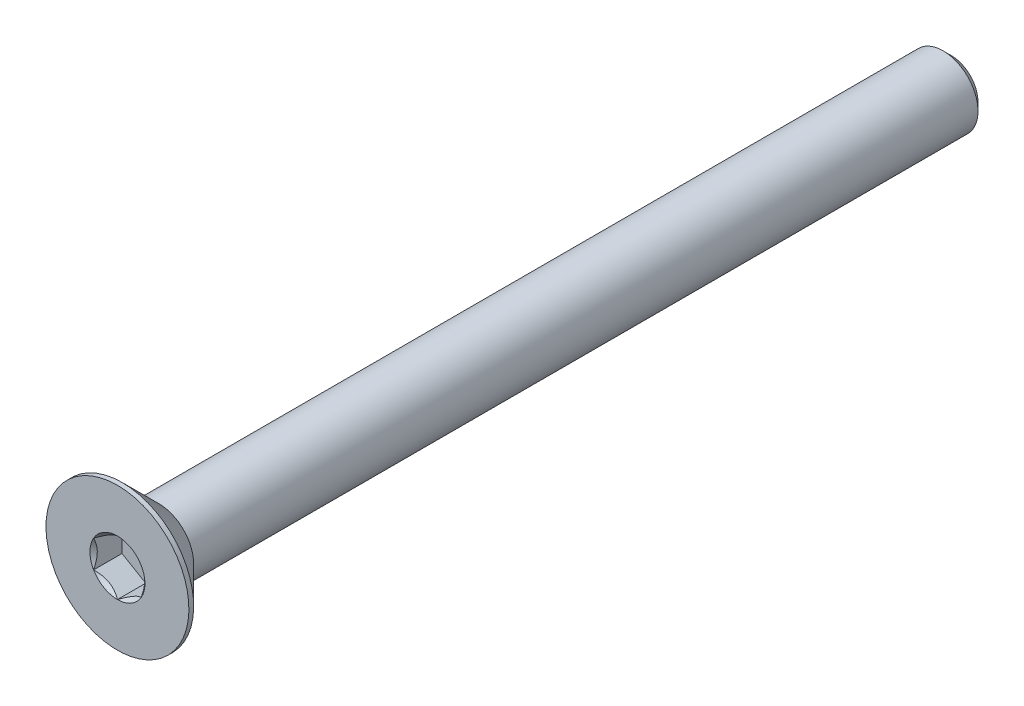
ISO-10303-21;
HEADER;
FILE_DESCRIPTION(('STEP AP214'),'2;1');
FILE_NAME('part.step','',(''),(''),'','','');
FILE_SCHEMA(('AUTOMOTIVE_DESIGN { 1 0 10303 214 1 1 1 1 }'));
ENDSEC;
DATA;
#1=APPLICATION_CONTEXT('core data for automotive mechanical design processes');
#2=APPLICATION_PROTOCOL_DEFINITION('international standard','automotive_design',2000,#1);
#3=PRODUCT_CONTEXT('',#1,'mechanical');
#4=PRODUCT('Part','Part','',(#3));
#5=PRODUCT_RELATED_PRODUCT_CATEGORY('part','',(#4));
#6=PRODUCT_DEFINITION_FORMATION('','',#4);
#7=PRODUCT_DEFINITION_CONTEXT('part definition',#1,'design');
#8=PRODUCT_DEFINITION('design','',#6,#7);
#9=PRODUCT_DEFINITION_SHAPE('','',#8);
#10=(LENGTH_UNIT() NAMED_UNIT(*) SI_UNIT(.MILLI.,.METRE.));
#11=(NAMED_UNIT(*) PLANE_ANGLE_UNIT() SI_UNIT($,.RADIAN.));
#12=(NAMED_UNIT(*) SI_UNIT($,.STERADIAN.) SOLID_ANGLE_UNIT());
#13=UNCERTAINTY_MEASURE_WITH_UNIT(LENGTH_MEASURE(1.E-05),#10,'distance_accuracy_value','');
#14=(GEOMETRIC_REPRESENTATION_CONTEXT(3) GLOBAL_UNCERTAINTY_ASSIGNED_CONTEXT((#13)) GLOBAL_UNIT_ASSIGNED_CONTEXT((#10,
#11,#12)) REPRESENTATION_CONTEXT('',''));
#15=CARTESIAN_POINT('',(0.,0.,0.));
#16=DIRECTION('',(0.,0.,1.));
#17=DIRECTION('',(1.,0.,0.));
#18=AXIS2_PLACEMENT_3D('',#15,#16,#17);
#19=CARTESIAN_POINT('',(0.,-1.15470053837925,-1.19));
#20=DIRECTION('',(0.5,-0.866025403784439,0.));
#21=DIRECTION('',(0.,0.,-1.));
#22=AXIS2_PLACEMENT_3D('',#19,#20,#21);
#23=PLANE('',#22);
#24=DIRECTION('',(0.,0.,1.));
#25=VECTOR('',#24,1.);
#26=CARTESIAN_POINT('',(0.,-1.15470053837925,-1.19));
#27=LINE('',#26,#25);
#28=CARTESIAN_POINT('',(0.,-1.15470053837925,-1.19));
#29=VERTEX_POINT('',#28);
#30=CARTESIAN_POINT('',(0.,-1.15470053837925,0.));
#31=VERTEX_POINT('',#30);
#32=EDGE_CURVE('E11',#29,#31,#27,.T.);
#33=ORIENTED_EDGE('',*,*,#32,.T.);
#34=CARTESIAN_POINT('',(0.,-1.15470053837922,0.));
#35=CARTESIAN_POINT('',(0.5,-0.866025403784439,-0.288675134594791));
#36=CARTESIAN_POINT('',(0.999999999999948,-0.577350269189655,0.));
#37=(BOUNDED_CURVE() B_SPLINE_CURVE(2,(#34,#35,#36),.UNSPECIFIED.,.F.,
.F.) B_SPLINE_CURVE_WITH_KNOTS((3,3),(-0.321867155116299,-0.124274873543865),
.UNSPECIFIED.) CURVE() GEOMETRIC_REPRESENTATION_ITEM() RATIONAL_B_SPLINE_CURVE((1.46410161513778,
1.69059892324148,1.46410161513778)) REPRESENTATION_ITEM(''));
#38=CARTESIAN_POINT('',(1.,-0.577350269189626,0.));
#39=VERTEX_POINT('',#38);
#40=EDGE_CURVE('E201',#31,#39,#37,.T.);
#41=ORIENTED_EDGE('',*,*,#40,.T.);
#42=DIRECTION('',(0.,0.,1.));
#43=VECTOR('',#42,1.);
#44=CARTESIAN_POINT('',(1.,-0.577350269189626,-1.19));
#45=LINE('',#44,#43);
#46=CARTESIAN_POINT('',(1.,-0.577350269189626,-1.19));
#47=VERTEX_POINT('',#46);
#48=EDGE_CURVE('E181',#47,#39,#45,.T.);
#49=ORIENTED_EDGE('',*,*,#48,.F.);
#50=DIRECTION('',(0.866025403784439,0.5,0.));
#51=VECTOR('',#50,1.);
#52=CARTESIAN_POINT('',(0.,-1.15470053837925,-1.19));
#53=LINE('',#52,#51);
#54=EDGE_CURVE('E193',#29,#47,#53,.T.);
#55=ORIENTED_EDGE('',*,*,#54,.F.);
#56=EDGE_LOOP('',(#33,#41,#49,#55));
#57=FACE_BOUND('',#56,.T.);
#58=ADVANCED_FACE('F17',(#57),#23,.F.);
#59=CARTESIAN_POINT('',(-1.,-0.577350269189626,-1.19));
#60=DIRECTION('',(-0.5,-0.866025403784439,0.));
#61=DIRECTION('',(-0.866025403784439,0.5,0.));
#62=AXIS2_PLACEMENT_3D('',#59,#60,#61);
#63=PLANE('',#62);
#64=DIRECTION('',(0.,0.,1.));
#65=VECTOR('',#64,1.);
#66=CARTESIAN_POINT('',(-1.,-0.577350269189626,-1.19));
#67=LINE('',#66,#65);
#68=CARTESIAN_POINT('',(-1.,-0.577350269189626,-1.19));
#69=VERTEX_POINT('',#68);
#70=CARTESIAN_POINT('',(-1.,-0.577350269189626,0.));
#71=VERTEX_POINT('',#70);
#72=EDGE_CURVE('E21',#69,#71,#67,.T.);
#73=ORIENTED_EDGE('',*,*,#72,.T.);
#74=CARTESIAN_POINT('',(-0.999999999999948,-0.577350269189655,0.));
#75=CARTESIAN_POINT('',(-0.499999999999999,-0.866025403784439,-0.28867513459479));
#76=CARTESIAN_POINT('',(0.,-1.15470053837922,0.));
#77=(BOUNDED_CURVE() B_SPLINE_CURVE(2,(#74,#75,#76),.UNSPECIFIED.,.F.,
.F.) B_SPLINE_CURVE_WITH_KNOTS((3,3),(-0.321867155116299,-0.124274873543865),
.UNSPECIFIED.) CURVE() GEOMETRIC_REPRESENTATION_ITEM() RATIONAL_B_SPLINE_CURVE((1.46410161513778,
1.69059892324148,1.46410161513778)) REPRESENTATION_ITEM(''));
#78=EDGE_CURVE('E167',#71,#31,#77,.T.);
#79=ORIENTED_EDGE('',*,*,#78,.T.);
#80=ORIENTED_EDGE('',*,*,#32,.F.);
#81=DIRECTION('',(0.866025403784439,-0.5,0.));
#82=VECTOR('',#81,1.);
#83=CARTESIAN_POINT('',(-1.,-0.577350269189626,-1.19));
#84=LINE('',#83,#82);
#85=EDGE_CURVE('E185',#69,#29,#84,.T.);
#86=ORIENTED_EDGE('',*,*,#85,.F.);
#87=EDGE_LOOP('',(#73,#79,#80,#86));
#88=FACE_BOUND('',#87,.T.);
#89=ADVANCED_FACE('F403',(#88),#63,.F.);
#90=CARTESIAN_POINT('',(-1.,0.577350269189626,-1.19));
#91=DIRECTION('',(-1.,0.,0.));
#92=DIRECTION('',(0.,0.,1.));
#93=AXIS2_PLACEMENT_3D('',#90,#91,#92);
#94=PLANE('',#93);
#95=DIRECTION('',(0.,0.,1.));
#96=VECTOR('',#95,1.);
#97=CARTESIAN_POINT('',(-1.,0.577350269189626,-1.19));
#98=LINE('',#97,#96);
#99=CARTESIAN_POINT('',(-1.,0.577350269189626,-1.19));
#100=VERTEX_POINT('',#99);
#101=CARTESIAN_POINT('',(-1.,0.577350269189626,0.));
#102=VERTEX_POINT('',#101);
#103=EDGE_CURVE('E65',#100,#102,#98,.T.);
#104=ORIENTED_EDGE('',*,*,#103,.T.);
#105=CARTESIAN_POINT('',(-1.,0.577350269189569,0.));
#106=CARTESIAN_POINT('',(-1.,0.,-0.28867513459479));
#107=CARTESIAN_POINT('',(-1.,-0.577350269189568,0.));
#108=(BOUNDED_CURVE() B_SPLINE_CURVE(2,(#105,#106,#107),.UNSPECIFIED.,.F.,
.F.) B_SPLINE_CURVE_WITH_KNOTS((3,3),(-0.3218671551163,-0.124274873543865),
.UNSPECIFIED.) CURVE() GEOMETRIC_REPRESENTATION_ITEM() RATIONAL_B_SPLINE_CURVE((1.46410161513777,
1.69059892324148,1.46410161513777)) REPRESENTATION_ITEM(''));
#109=EDGE_CURVE('E162',#102,#71,#108,.T.);
#110=ORIENTED_EDGE('',*,*,#109,.T.);
#111=ORIENTED_EDGE('',*,*,#72,.F.);
#112=DIRECTION('',(0.,-1.,0.));
#113=VECTOR('',#112,1.);
#114=CARTESIAN_POINT('',(-1.,0.577350269189626,-1.19));
#115=LINE('',#114,#113);
#116=EDGE_CURVE('E206',#100,#69,#115,.T.);
#117=ORIENTED_EDGE('',*,*,#116,.F.);
#118=EDGE_LOOP('',(#104,#110,#111,#117));
#119=FACE_BOUND('',#118,.T.);
#120=ADVANCED_FACE('F19',(#119),#94,.F.);
#121=CARTESIAN_POINT('',(0.,1.15470053837925,-1.19));
#122=DIRECTION('',(-0.5,0.866025403784439,0.));
#123=DIRECTION('',(0.,0.,1.));
#124=AXIS2_PLACEMENT_3D('',#121,#122,#123);
#125=PLANE('',#124);
#126=DIRECTION('',(0.,0.,1.));
#127=VECTOR('',#126,1.);
#128=CARTESIAN_POINT('',(0.,1.15470053837925,-1.19));
#129=LINE('',#128,#127);
#130=CARTESIAN_POINT('',(0.,1.15470053837925,-1.19));
#131=VERTEX_POINT('',#130);
#132=CARTESIAN_POINT('',(0.,1.15470053837925,0.));
#133=VERTEX_POINT('',#132);
#134=EDGE_CURVE('E208',#131,#133,#129,.T.);
#135=ORIENTED_EDGE('',*,*,#134,.T.);
#136=CARTESIAN_POINT('',(0.,1.15470053837922,0.));
#137=CARTESIAN_POINT('',(-0.5,0.866025403784439,-0.28867513459479));
#138=CARTESIAN_POINT('',(-0.999999999999949,0.577350269189655,0.));
#139=(BOUNDED_CURVE() B_SPLINE_CURVE(2,(#136,#137,#138),.UNSPECIFIED.,.F.,
.F.) B_SPLINE_CURVE_WITH_KNOTS((3,3),(-0.3218671551163,-0.124274873543865),
.UNSPECIFIED.) CURVE() GEOMETRIC_REPRESENTATION_ITEM() RATIONAL_B_SPLINE_CURVE((1.46410161513778,
1.69059892324148,1.46410161513778)) REPRESENTATION_ITEM(''));
#140=EDGE_CURVE('E168',#133,#102,#139,.T.);
#141=ORIENTED_EDGE('',*,*,#140,.T.);
#142=ORIENTED_EDGE('',*,*,#103,.F.);
#143=DIRECTION('',(-0.866025403784439,-0.5,0.));
#144=VECTOR('',#143,1.);
#145=CARTESIAN_POINT('',(0.,1.15470053837925,-1.19));
#146=LINE('',#145,#144);
#147=EDGE_CURVE('E202',#131,#100,#146,.T.);
#148=ORIENTED_EDGE('',*,*,#147,.F.);
#149=EDGE_LOOP('',(#135,#141,#142,#148));
#150=FACE_BOUND('',#149,.T.);
#151=ADVANCED_FACE('F384',(#150),#125,.F.);
#152=CARTESIAN_POINT('',(1.,0.577350269189626,-1.19));
#153=DIRECTION('',(0.5,0.866025403784439,0.));
#154=DIRECTION('',(0.,0.,-1.));
#155=AXIS2_PLACEMENT_3D('',#152,#153,#154);
#156=PLANE('',#155);
#157=DIRECTION('',(0.,0.,1.));
#158=VECTOR('',#157,1.);
#159=CARTESIAN_POINT('',(1.,0.577350269189626,-1.19));
#160=LINE('',#159,#158);
#161=CARTESIAN_POINT('',(1.,0.577350269189626,-1.19));
#162=VERTEX_POINT('',#161);
#163=CARTESIAN_POINT('',(1.,0.577350269189626,0.));
#164=VERTEX_POINT('',#163);
#165=EDGE_CURVE('E184',#162,#164,#160,.T.);
#166=ORIENTED_EDGE('',*,*,#165,.T.);
#167=CARTESIAN_POINT('',(0.999999999999951,0.577350269189654,0.));
#168=CARTESIAN_POINT('',(0.5,0.866025403784439,-0.288675134594791));
#169=CARTESIAN_POINT('',(0.,1.15470053837922,0.));
#170=(BOUNDED_CURVE() B_SPLINE_CURVE(2,(#167,#168,#169),.UNSPECIFIED.,.F.,
.F.) B_SPLINE_CURVE_WITH_KNOTS((3,3),(-0.3218671551163,-0.124274873543865),
.UNSPECIFIED.) CURVE() GEOMETRIC_REPRESENTATION_ITEM() RATIONAL_B_SPLINE_CURVE((1.46410161513778,
1.69059892324148,1.46410161513778)) REPRESENTATION_ITEM(''));
#171=EDGE_CURVE('E487',#164,#133,#170,.T.);
#172=ORIENTED_EDGE('',*,*,#171,.T.);
#173=ORIENTED_EDGE('',*,*,#134,.F.);
#174=DIRECTION('',(-0.866025403784439,0.5,0.));
#175=VECTOR('',#174,1.);
#176=CARTESIAN_POINT('',(1.,0.577350269189626,-1.19));
#177=LINE('',#176,#175);
#178=EDGE_CURVE('E207',#162,#131,#177,.T.);
#179=ORIENTED_EDGE('',*,*,#178,.F.);
#180=EDGE_LOOP('',(#166,#172,#173,#179));
#181=FACE_BOUND('',#180,.T.);
#182=ADVANCED_FACE('F374',(#181),#156,.F.);
#183=CARTESIAN_POINT('',(1.,-0.577350269189626,-1.19));
#184=DIRECTION('',(1.,0.,0.));
#185=DIRECTION('',(0.,1.,0.));
#186=AXIS2_PLACEMENT_3D('',#183,#184,#185);
#187=PLANE('',#186);
#188=ORIENTED_EDGE('',*,*,#48,.T.);
#189=CARTESIAN_POINT('',(1.,-0.577350269189567,0.));
#190=CARTESIAN_POINT('',(1.,0.,-0.28867513459479));
#191=CARTESIAN_POINT('',(1.,0.577350269189568,0.));
#192=(BOUNDED_CURVE() B_SPLINE_CURVE(2,(#189,#190,#191),.UNSPECIFIED.,.F.,
.F.) B_SPLINE_CURVE_WITH_KNOTS((3,3),(-0.321867155116299,-0.124274873543865),
.UNSPECIFIED.) CURVE() GEOMETRIC_REPRESENTATION_ITEM() RATIONAL_B_SPLINE_CURVE((1.46410161513778,
1.69059892324148,1.46410161513778)) REPRESENTATION_ITEM(''));
#193=EDGE_CURVE('E123',#39,#164,#192,.T.);
#194=ORIENTED_EDGE('',*,*,#193,.T.);
#195=ORIENTED_EDGE('',*,*,#165,.F.);
#196=DIRECTION('',(0.,1.,0.));
#197=VECTOR('',#196,1.);
#198=CARTESIAN_POINT('',(1.,-0.577350269189626,-1.19));
#199=LINE('',#198,#197);
#200=EDGE_CURVE('E200',#47,#162,#199,.T.);
#201=ORIENTED_EDGE('',*,*,#200,.F.);
#202=EDGE_LOOP('',(#188,#194,#195,#201));
#203=FACE_BOUND('',#202,.T.);
#204=ADVANCED_FACE('F364',(#203),#187,.F.);
#205=CARTESIAN_POINT('',(1.,-0.577350269189626,-1.19));
#206=DIRECTION('',(0.,0.,1.));
#207=DIRECTION('',(1.,0.,0.));
#208=AXIS2_PLACEMENT_3D('',#205,#206,#207);
#209=PLANE('',#208);
#210=ORIENTED_EDGE('',*,*,#54,.T.);
#211=ORIENTED_EDGE('',*,*,#200,.T.);
#212=ORIENTED_EDGE('',*,*,#178,.T.);
#213=ORIENTED_EDGE('',*,*,#147,.T.);
#214=ORIENTED_EDGE('',*,*,#116,.T.);
#215=ORIENTED_EDGE('',*,*,#85,.T.);
#216=EDGE_LOOP('',(#210,#211,#212,#213,#214,#215));
#217=FACE_BOUND('',#216,.T.);
#218=ADVANCED_FACE('F353',(#217),#209,.T.);
#219=CARTESIAN_POINT('',(0.,0.,0.));
#220=DIRECTION('',(0.,0.,1.));
#221=DIRECTION('',(1.,0.,0.));
#222=AXIS2_PLACEMENT_3D('',#219,#220,#221);
#223=CONICAL_SURFACE('',#222,1.15470053837925,0.78539816339745);
#224=CARTESIAN_POINT('',(0.,0.,0.));
#225=DIRECTION('',(0.,0.,1.));
#226=DIRECTION('',(1.,0.,0.));
#227=AXIS2_PLACEMENT_3D('',#224,#225,#226);
#228=CIRCLE('',#227,1.15470053837925);
#229=EDGE_CURVE('E146',#31,#39,#228,.T.);
#230=ORIENTED_EDGE('',*,*,#229,.T.);
#231=ORIENTED_EDGE('',*,*,#40,.F.);
#232=EDGE_LOOP('',(#230,#231));
#233=FACE_BOUND('',#232,.T.);
#234=ADVANCED_FACE('F341',(#233),#223,.F.);
#235=CARTESIAN_POINT('',(0.,0.,0.));
#236=DIRECTION('',(0.,0.,1.));
#237=DIRECTION('',(1.,0.,0.));
#238=AXIS2_PLACEMENT_3D('',#235,#236,#237);
#239=CONICAL_SURFACE('',#238,1.15470053837925,0.78539816339745);
#240=CARTESIAN_POINT('',(0.,0.,0.));
#241=DIRECTION('',(0.,0.,1.));
#242=DIRECTION('',(1.,0.,0.));
#243=AXIS2_PLACEMENT_3D('',#240,#241,#242);
#244=CIRCLE('',#243,1.15470053837925);
#245=EDGE_CURVE('E150',#71,#31,#244,.T.);
#246=ORIENTED_EDGE('',*,*,#245,.T.);
#247=ORIENTED_EDGE('',*,*,#78,.F.);
#248=EDGE_LOOP('',(#246,#247));
#249=FACE_BOUND('',#248,.T.);
#250=ADVANCED_FACE('F330',(#249),#239,.F.);
#251=CARTESIAN_POINT('',(0.,0.,0.));
#252=DIRECTION('',(0.,0.,1.));
#253=DIRECTION('',(-1.,0.,0.));
#254=AXIS2_PLACEMENT_3D('',#251,#252,#253);
#255=CONICAL_SURFACE('',#254,1.15470053837925,0.78539816339745);
#256=CARTESIAN_POINT('',(0.,0.,0.));
#257=DIRECTION('',(0.,0.,1.));
#258=DIRECTION('',(1.,0.,0.));
#259=AXIS2_PLACEMENT_3D('',#256,#257,#258);
#260=CIRCLE('',#259,1.15470053837925);
#261=EDGE_CURVE('E180',#102,#71,#260,.T.);
#262=ORIENTED_EDGE('',*,*,#261,.T.);
#263=ORIENTED_EDGE('',*,*,#109,.F.);
#264=EDGE_LOOP('',(#262,#263));
#265=FACE_BOUND('',#264,.T.);
#266=ADVANCED_FACE('F320',(#265),#255,.F.);
#267=CARTESIAN_POINT('',(0.,0.,0.));
#268=DIRECTION('',(0.,0.,1.));
#269=DIRECTION('',(1.,0.,0.));
#270=AXIS2_PLACEMENT_3D('',#267,#268,#269);
#271=CONICAL_SURFACE('',#270,1.15470053837925,0.78539816339745);
#272=CARTESIAN_POINT('',(0.,0.,0.));
#273=DIRECTION('',(0.,0.,1.));
#274=DIRECTION('',(1.,0.,0.));
#275=AXIS2_PLACEMENT_3D('',#272,#273,#274);
#276=CIRCLE('',#275,1.15470053837925);
#277=EDGE_CURVE('E176',#133,#102,#276,.T.);
#278=ORIENTED_EDGE('',*,*,#277,.T.);
#279=ORIENTED_EDGE('',*,*,#140,.F.);
#280=EDGE_LOOP('',(#278,#279));
#281=FACE_BOUND('',#280,.T.);
#282=ADVANCED_FACE('F310',(#281),#271,.F.);
#283=CARTESIAN_POINT('',(0.,0.,0.));
#284=DIRECTION('',(0.,0.,1.));
#285=DIRECTION('',(1.,0.,0.));
#286=AXIS2_PLACEMENT_3D('',#283,#284,#285);
#287=CONICAL_SURFACE('',#286,1.15470053837925,0.78539816339745);
#288=CARTESIAN_POINT('',(0.,0.,0.));
#289=DIRECTION('',(0.,0.,1.));
#290=DIRECTION('',(1.,0.,0.));
#291=AXIS2_PLACEMENT_3D('',#288,#289,#290);
#292=CIRCLE('',#291,1.15470053837925);
#293=EDGE_CURVE('E144',#164,#133,#292,.T.);
#294=ORIENTED_EDGE('',*,*,#293,.T.);
#295=ORIENTED_EDGE('',*,*,#171,.F.);
#296=EDGE_LOOP('',(#294,#295));
#297=FACE_BOUND('',#296,.T.);
#298=ADVANCED_FACE('F299',(#297),#287,.F.);
#299=CARTESIAN_POINT('',(0.,-1.5,0.));
#300=DIRECTION('',(0.,0.,1.));
#301=DIRECTION('',(0.,-1.,0.));
#302=AXIS2_PLACEMENT_3D('',#299,#300,#301);
#303=PLANE('',#302);
#304=ORIENTED_EDGE('',*,*,#229,.F.);
#305=ORIENTED_EDGE('',*,*,#245,.F.);
#306=ORIENTED_EDGE('',*,*,#261,.F.);
#307=ORIENTED_EDGE('',*,*,#277,.F.);
#308=ORIENTED_EDGE('',*,*,#293,.F.);
#309=CARTESIAN_POINT('',(0.,0.,0.));
#310=DIRECTION('',(0.,0.,1.));
#311=DIRECTION('',(1.,0.,0.));
#312=AXIS2_PLACEMENT_3D('',#309,#310,#311);
#313=CIRCLE('',#312,1.15470053837925);
#314=EDGE_CURVE('E152',#39,#164,#313,.T.);
#315=ORIENTED_EDGE('',*,*,#314,.F.);
#316=EDGE_LOOP('',(#304,#305,#306,#307,#308,#315));
#317=FACE_BOUND('',#316,.T.);
#318=CARTESIAN_POINT('',(0.,0.,0.));
#319=DIRECTION('',(0.,0.,1.));
#320=DIRECTION('',(0.,-1.,0.));
#321=AXIS2_PLACEMENT_3D('',#318,#319,#320);
#322=CIRCLE('',#321,3.);
#323=CARTESIAN_POINT('',(0.,3.,0.));
#324=VERTEX_POINT('',#323);
#325=EDGE_CURVE('E156',#324,#324,#322,.T.);
#326=ORIENTED_EDGE('',*,*,#325,.T.);
#327=EDGE_LOOP('',(#326));
#328=FACE_BOUND('',#327,.T.);
#329=ADVANCED_FACE('F288',(#317,#328),#303,.T.);
#330=CARTESIAN_POINT('',(0.,-1.5,-35.));
#331=DIRECTION('',(0.,0.,-1.));
#332=DIRECTION('',(-1.,0.,0.));
#333=AXIS2_PLACEMENT_3D('',#330,#331,#332);
#334=PLANE('',#333);
#335=CARTESIAN_POINT('',(0.,0.,-35.));
#336=DIRECTION('',(0.,0.,-1.));
#337=DIRECTION('',(1.,0.,0.));
#338=AXIS2_PLACEMENT_3D('',#335,#336,#337);
#339=CIRCLE('',#338,1.125);
#340=CARTESIAN_POINT('',(-1.125,0.,-35.));
#341=VERTEX_POINT('',#340);
#342=EDGE_CURVE('E157',#341,#341,#339,.T.);
#343=ORIENTED_EDGE('',*,*,#342,.T.);
#344=EDGE_LOOP('',(#343));
#345=FACE_BOUND('',#344,.T.);
#346=ADVANCED_FACE('F277',(#345),#334,.T.);
#347=CARTESIAN_POINT('',(0.,0.,0.));
#348=DIRECTION('',(0.,0.,1.));
#349=DIRECTION('',(0.,-1.,0.));
#350=AXIS2_PLACEMENT_3D('',#347,#348,#349);
#351=CYLINDRICAL_SURFACE('',#350,3.);
#352=ORIENTED_EDGE('',*,*,#325,.F.);
#353=DIRECTION('',(0.,0.,-1.));
#354=VECTOR('',#353,1.);
#355=CARTESIAN_POINT('',(0.,3.,0.));
#356=LINE('',#355,#354);
#357=CARTESIAN_POINT('',(0.,3.,-0.200000000000012));
#358=VERTEX_POINT('',#357);
#359=EDGE_CURVE('E151',#324,#358,#356,.T.);
#360=ORIENTED_EDGE('',*,*,#359,.T.);
#361=CARTESIAN_POINT('',(0.,0.,-0.200000000000009));
#362=DIRECTION('',(0.,0.,1.));
#363=DIRECTION('',(0.,-1.,0.));
#364=AXIS2_PLACEMENT_3D('',#361,#362,#363);
#365=CIRCLE('',#364,3.);
#366=EDGE_CURVE('E121',#358,#358,#365,.T.);
#367=ORIENTED_EDGE('',*,*,#366,.T.);
#368=ORIENTED_EDGE('',*,*,#359,.F.);
#369=EDGE_LOOP('',(#352,#360,#367,#368));
#370=FACE_BOUND('',#369,.T.);
#371=ADVANCED_FACE('F266',(#370),#351,.T.);
#372=CARTESIAN_POINT('',(0.,0.,0.));
#373=DIRECTION('',(0.,0.,1.));
#374=DIRECTION('',(1.,0.,0.));
#375=AXIS2_PLACEMENT_3D('',#372,#373,#374);
#376=CONICAL_SURFACE('',#375,1.15470053837925,0.78539816339745);
#377=ORIENTED_EDGE('',*,*,#193,.F.);
#378=ORIENTED_EDGE('',*,*,#314,.T.);
#379=EDGE_LOOP('',(#377,#378));
#380=FACE_BOUND('',#379,.T.);
#381=ADVANCED_FACE('F255',(#380),#376,.F.);
#382=CARTESIAN_POINT('',(0.,0.,-1.7));
#383=DIRECTION('',(0.,0.,1.));
#384=DIRECTION('',(0.,-1.,0.));
#385=AXIS2_PLACEMENT_3D('',#382,#383,#384);
#386=CONICAL_SURFACE('',#385,1.5,0.785398163397449);
#387=ORIENTED_EDGE('',*,*,#366,.F.);
#388=DIRECTION('',(0.,-0.707106781186549,-0.707106781186546));
#389=VECTOR('',#388,1.);
#390=CARTESIAN_POINT('',(0.,1.5,-1.7));
#391=LINE('',#390,#389);
#392=CARTESIAN_POINT('',(0.,1.4635,-1.7365));
#393=VERTEX_POINT('',#392);
#394=EDGE_CURVE('E114',#358,#393,#391,.T.);
#395=ORIENTED_EDGE('',*,*,#394,.T.);
#396=CARTESIAN_POINT('',(0.,0.,-1.7365));
#397=DIRECTION('',(0.,0.,1.));
#398=DIRECTION('',(0.,1.,0.));
#399=AXIS2_PLACEMENT_3D('',#396,#397,#398);
#400=CIRCLE('',#399,1.4635);
#401=CARTESIAN_POINT('',(0.,-1.4635,-1.7365));
#402=VERTEX_POINT('',#401);
#403=EDGE_CURVE('E118',#393,#402,#400,.T.);
#404=ORIENTED_EDGE('',*,*,#403,.T.);
#405=CARTESIAN_POINT('',(0.,0.,-1.7365));
#406=DIRECTION('',(0.,0.,1.));
#407=DIRECTION('',(0.,1.,0.));
#408=AXIS2_PLACEMENT_3D('',#405,#406,#407);
#409=CIRCLE('',#408,1.4635);
#410=EDGE_CURVE('E125',#402,#393,#409,.T.);
#411=ORIENTED_EDGE('',*,*,#410,.T.);
#412=ORIENTED_EDGE('',*,*,#394,.F.);
#413=EDGE_LOOP('',(#387,#395,#404,#411,#412));
#414=FACE_BOUND('',#413,.T.);
#415=ADVANCED_FACE('F116',(#414),#386,.T.);
#416=CARTESIAN_POINT('',(0.,0.,-35.));
#417=DIRECTION('',(0.,0.,-1.));
#418=DIRECTION('',(0.,1.,0.));
#419=AXIS2_PLACEMENT_3D('',#416,#417,#418);
#420=CYLINDRICAL_SURFACE('',#419,1.4635);
#421=CARTESIAN_POINT('',(0.,0.,-34.6615));
#422=DIRECTION('',(0.,0.,1.));
#423=DIRECTION('',(0.,1.,0.));
#424=AXIS2_PLACEMENT_3D('',#421,#422,#423);
#425=CIRCLE('',#424,1.4635);
#426=CARTESIAN_POINT('',(0.,-1.4635,-34.6615));
#427=VERTEX_POINT('',#426);
#428=CARTESIAN_POINT('',(-1.4635,0.,-34.6615));
#429=VERTEX_POINT('',#428);
#430=EDGE_CURVE('E175',#427,#429,#425,.T.);
#431=ORIENTED_EDGE('',*,*,#430,.T.);
#432=CARTESIAN_POINT('',(0.,0.,-34.6615));
#433=DIRECTION('',(0.,0.,1.));
#434=DIRECTION('',(0.,1.,0.));
#435=AXIS2_PLACEMENT_3D('',#432,#433,#434);
#436=CIRCLE('',#435,1.4635);
#437=EDGE_CURVE('E140',#429,#427,#436,.T.);
#438=ORIENTED_EDGE('',*,*,#437,.T.);
#439=DIRECTION('',(0.,0.,1.));
#440=VECTOR('',#439,1.);
#441=CARTESIAN_POINT('',(0.,-1.4635,-35.));
#442=LINE('',#441,#440);
#443=EDGE_CURVE('E133',#427,#402,#442,.T.);
#444=ORIENTED_EDGE('',*,*,#443,.T.);
#445=ORIENTED_EDGE('',*,*,#403,.F.);
#446=ORIENTED_EDGE('',*,*,#410,.F.);
#447=ORIENTED_EDGE('',*,*,#443,.F.);
#448=EDGE_LOOP('',(#431,#438,#444,#445,#446,#447));
#449=FACE_BOUND('',#448,.T.);
#450=ADVANCED_FACE('F131',(#449),#420,.T.);
#451=CARTESIAN_POINT('',(0.,0.,-34.8125));
#452=DIRECTION('',(0.,0.,1.));
#453=DIRECTION('',(1.,0.,0.));
#454=AXIS2_PLACEMENT_3D('',#451,#452,#453);
#455=CONICAL_SURFACE('',#454,1.3125,0.785398163397451);
#456=ORIENTED_EDGE('',*,*,#342,.F.);
#457=DIRECTION('',(-0.70710678118655,0.,0.707106781186545));
#458=VECTOR('',#457,1.);
#459=CARTESIAN_POINT('',(-1.3125,0.,-34.8125));
#460=LINE('',#459,#458);
#461=EDGE_CURVE('E161',#341,#429,#460,.T.);
#462=ORIENTED_EDGE('',*,*,#461,.T.);
#463=ORIENTED_EDGE('',*,*,#430,.F.);
#464=ORIENTED_EDGE('',*,*,#437,.F.);
#465=ORIENTED_EDGE('',*,*,#461,.F.);
#466=EDGE_LOOP('',(#456,#462,#463,#464,#465));
#467=FACE_BOUND('',#466,.T.);
#468=ADVANCED_FACE('F225',(#467),#455,.T.);
#469=CLOSED_SHELL('',(#58,#89,#120,#151,#182,#204,#218,#234,#250,#266,#282,#298,#329,#346,#371,
#381,#415,#450,#468));
#470=MANIFOLD_SOLID_BREP('B1',#469);
#471=ADVANCED_BREP_SHAPE_REPRESENTATION('',(#18,#470),#14);
#472=SHAPE_DEFINITION_REPRESENTATION(#9,#471);
ENDSEC;
END-ISO-10303-21;
